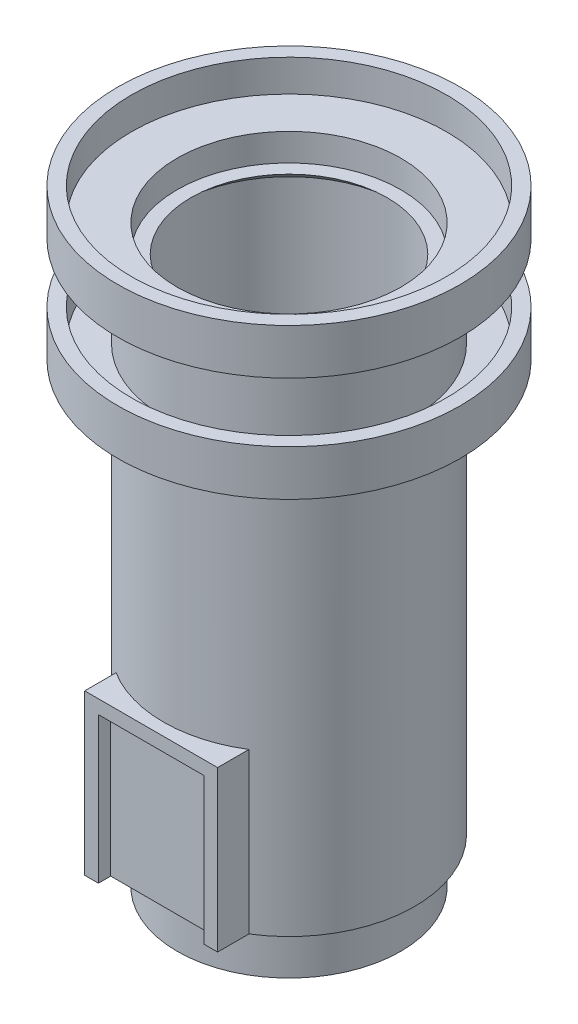
ISO-10303-21;
HEADER;
FILE_DESCRIPTION(('STEP AP214'),'2;1');
FILE_NAME('part.step','',(''),(''),'','','');
FILE_SCHEMA(('AUTOMOTIVE_DESIGN { 1 0 10303 214 1 1 1 1 }'));
ENDSEC;
DATA;
#1=APPLICATION_CONTEXT('core data for automotive mechanical design processes');
#2=APPLICATION_PROTOCOL_DEFINITION('international standard','automotive_design',2000,#1);
#3=PRODUCT_CONTEXT('',#1,'mechanical');
#4=PRODUCT('Part','Part','',(#3));
#5=PRODUCT_RELATED_PRODUCT_CATEGORY('part','',(#4));
#6=PRODUCT_DEFINITION_FORMATION('','',#4);
#7=PRODUCT_DEFINITION_CONTEXT('part definition',#1,'design');
#8=PRODUCT_DEFINITION('design','',#6,#7);
#9=PRODUCT_DEFINITION_SHAPE('','',#8);
#10=(LENGTH_UNIT() NAMED_UNIT(*) SI_UNIT(.MILLI.,.METRE.));
#11=(NAMED_UNIT(*) PLANE_ANGLE_UNIT() SI_UNIT($,.RADIAN.));
#12=(NAMED_UNIT(*) SI_UNIT($,.STERADIAN.) SOLID_ANGLE_UNIT());
#13=UNCERTAINTY_MEASURE_WITH_UNIT(LENGTH_MEASURE(1.E-05),#10,'distance_accuracy_value','');
#14=(GEOMETRIC_REPRESENTATION_CONTEXT(3) GLOBAL_UNCERTAINTY_ASSIGNED_CONTEXT((#13)) GLOBAL_UNIT_ASSIGNED_CONTEXT((#10,
#11,#12)) REPRESENTATION_CONTEXT('',''));
#15=CARTESIAN_POINT('',(0.,0.,0.));
#16=DIRECTION('',(0.,0.,1.));
#17=DIRECTION('',(1.,0.,0.));
#18=AXIS2_PLACEMENT_3D('',#15,#16,#17);
#19=CARTESIAN_POINT('',(-39.2129955139234,3.51989743721269,0.));
#20=DIRECTION('',(0.,-1.,0.));
#21=DIRECTION('',(1.,0.,0.));
#22=AXIS2_PLACEMENT_3D('',#19,#20,#21);
#23=PLANE('',#22);
#24=CARTESIAN_POINT('',(-17.7129955139234,3.51989743721269,0.));
#25=DIRECTION('',(0.,1.,0.));
#26=DIRECTION('',(-1.,0.,0.));
#27=AXIS2_PLACEMENT_3D('',#24,#25,#26);
#28=CIRCLE('',#27,21.5);
#29=CARTESIAN_POINT('',(-39.2129955139234,3.51989743721269,0.));
#30=VERTEX_POINT('',#29);
#31=EDGE_CURVE('E157',#30,#30,#28,.T.);
#32=ORIENTED_EDGE('',*,*,#31,.T.);
#33=EDGE_LOOP('',(#32));
#34=FACE_BOUND('',#33,.T.);
#35=CARTESIAN_POINT('',(-17.7129955139234,3.51989743721269,0.));
#36=DIRECTION('',(0.,1.,0.));
#37=DIRECTION('',(-1.,0.,0.));
#38=AXIS2_PLACEMENT_3D('',#35,#36,#37);
#39=CIRCLE('',#38,24.5);
#40=CARTESIAN_POINT('',(-42.2129955139234,3.51989743721269,0.));
#41=VERTEX_POINT('',#40);
#42=EDGE_CURVE('E11',#41,#41,#39,.T.);
#43=ORIENTED_EDGE('',*,*,#42,.F.);
#44=EDGE_LOOP('',(#43));
#45=FACE_BOUND('',#44,.T.);
#46=ADVANCED_FACE('F32',(#34,#45),#23,.T.);
#47=CARTESIAN_POINT('',(-17.7129955139234,104.262295081967,0.));
#48=DIRECTION('',(0.,1.,0.));
#49=DIRECTION('',(-1.,0.,0.));
#50=AXIS2_PLACEMENT_3D('',#47,#48,#49);
#51=CYLINDRICAL_SURFACE('',#50,24.5);
#52=ORIENTED_EDGE('',*,*,#42,.T.);
#53=EDGE_LOOP('',(#52));
#54=FACE_BOUND('',#53,.T.);
#55=CARTESIAN_POINT('',(-17.7129955139234,13.5198974372127,0.));
#56=DIRECTION('',(0.,1.,0.));
#57=DIRECTION('',(-1.,0.,0.));
#58=AXIS2_PLACEMENT_3D('',#55,#56,#57);
#59=CIRCLE('',#58,24.5);
#60=CARTESIAN_POINT('',(-42.2129955139234,13.5198974372127,0.));
#61=VERTEX_POINT('',#60);
#62=EDGE_CURVE('E39',#61,#61,#59,.T.);
#63=ORIENTED_EDGE('',*,*,#62,.F.);
#64=EDGE_LOOP('',(#63));
#65=FACE_BOUND('',#64,.T.);
#66=ADVANCED_FACE('F222',(#54,#65),#51,.T.);
#67=CARTESIAN_POINT('',(-42.2129955139234,13.5198974372127,0.));
#68=DIRECTION('',(0.,-1.,0.));
#69=DIRECTION('',(1.,0.,0.));
#70=AXIS2_PLACEMENT_3D('',#67,#68,#69);
#71=PLANE('',#70);
#72=DIRECTION('',(0.,0.,1.));
#73=VECTOR('',#72,1.);
#74=CARTESIAN_POINT('',(-29.267838598035,13.5198974372127,27.502521141036));
#75=LINE('',#74,#73);
#76=CARTESIAN_POINT('',(-29.267838598035,13.5198974372127,27.502521141036));
#77=VERTEX_POINT('',#76);
#78=CARTESIAN_POINT('',(-29.267838598035,13.5198974372127,30.202521141036));
#79=VERTEX_POINT('',#78);
#80=EDGE_CURVE('E97',#77,#79,#75,.T.);
#81=ORIENTED_EDGE('',*,*,#80,.T.);
#82=DIRECTION('',(-1.,0.,0.));
#83=VECTOR('',#82,1.);
#84=CARTESIAN_POINT('',(-32.267838598035,13.5198974372127,30.202521141036));
#85=LINE('',#84,#83);
#86=CARTESIAN_POINT('',(-32.267838598035,13.5198974372127,30.202521141036));
#87=VERTEX_POINT('',#86);
#88=EDGE_CURVE('E151',#79,#87,#85,.T.);
#89=ORIENTED_EDGE('',*,*,#88,.T.);
#90=DIRECTION('',(0.,0.,-1.));
#91=VECTOR('',#90,1.);
#92=CARTESIAN_POINT('',(-32.267838598035,13.5198974372127,23.332521141036));
#93=LINE('',#92,#91);
#94=CARTESIAN_POINT('',(-32.267838598035,13.5198974372127,23.332521141036));
#95=VERTEX_POINT('',#94);
#96=EDGE_CURVE('E139',#87,#95,#93,.T.);
#97=ORIENTED_EDGE('',*,*,#96,.T.);
#98=CARTESIAN_POINT('',(-17.7129955139234,13.5198974372127,0.));
#99=DIRECTION('',(0.,1.,0.));
#100=DIRECTION('',(-1.,0.,0.));
#101=AXIS2_PLACEMENT_3D('',#98,#99,#100);
#102=CIRCLE('',#101,27.5000000000001);
#103=CARTESIAN_POINT('',(-3.15815242981178,13.5198974372127,23.332521141036));
#104=VERTEX_POINT('',#103);
#105=EDGE_CURVE('E218',#104,#95,#102,.T.);
#106=ORIENTED_EDGE('',*,*,#105,.F.);
#107=DIRECTION('',(0.,0.,1.));
#108=VECTOR('',#107,1.);
#109=CARTESIAN_POINT('',(-3.15815242981178,13.5198974372127,23.332521141036));
#110=LINE('',#109,#108);
#111=CARTESIAN_POINT('',(-3.15815242981178,13.5198974372127,30.202521141036));
#112=VERTEX_POINT('',#111);
#113=EDGE_CURVE('E132',#104,#112,#110,.T.);
#114=ORIENTED_EDGE('',*,*,#113,.T.);
#115=CARTESIAN_POINT('',(-6.15815242981178,13.5198974372127,30.202521141036));
#116=VERTEX_POINT('',#115);
#117=EDGE_CURVE('E152',#112,#116,#85,.T.);
#118=ORIENTED_EDGE('',*,*,#117,.T.);
#119=DIRECTION('',(0.,0.,1.));
#120=VECTOR('',#119,1.);
#121=CARTESIAN_POINT('',(-6.15815242981178,13.5198974372127,27.502521141036));
#122=LINE('',#121,#120);
#123=CARTESIAN_POINT('',(-6.15815242981178,13.5198974372127,27.502521141036));
#124=VERTEX_POINT('',#123);
#125=EDGE_CURVE('E46',#124,#116,#122,.T.);
#126=ORIENTED_EDGE('',*,*,#125,.F.);
#127=DIRECTION('',(1.,0.,0.));
#128=VECTOR('',#127,1.);
#129=CARTESIAN_POINT('',(-29.267838598035,13.5198974372127,27.502521141036));
#130=LINE('',#129,#128);
#131=EDGE_CURVE('E113',#77,#124,#130,.T.);
#132=ORIENTED_EDGE('',*,*,#131,.F.);
#133=EDGE_LOOP('',(#81,#89,#97,#106,#114,#118,#126,#132));
#134=FACE_BOUND('',#133,.T.);
#135=ORIENTED_EDGE('',*,*,#62,.T.);
#136=EDGE_LOOP('',(#135));
#137=FACE_BOUND('',#136,.T.);
#138=ADVANCED_FACE('F117',(#134,#137),#71,.T.);
#139=CARTESIAN_POINT('',(-17.7129955139234,104.262295081967,0.));
#140=DIRECTION('',(0.,1.,0.));
#141=DIRECTION('',(-1.,0.,0.));
#142=AXIS2_PLACEMENT_3D('',#139,#140,#141);
#143=CYLINDRICAL_SURFACE('',#142,27.5000000000001);
#144=DIRECTION('',(0.,-1.,0.));
#145=VECTOR('',#144,1.);
#146=CARTESIAN_POINT('',(-32.267838598035,48.5198974372127,23.332521141036));
#147=LINE('',#146,#145);
#148=CARTESIAN_POINT('',(-32.267838598035,48.5198974372127,23.332521141036));
#149=VERTEX_POINT('',#148);
#150=EDGE_CURVE('E54',#149,#95,#147,.T.);
#151=ORIENTED_EDGE('',*,*,#150,.F.);
#152=CARTESIAN_POINT('',(-17.7129955139234,48.5198974372127,0.));
#153=DIRECTION('',(0.,1.,0.));
#154=DIRECTION('',(-1.,0.,0.));
#155=AXIS2_PLACEMENT_3D('',#152,#153,#154);
#156=CIRCLE('',#155,27.5);
#157=CARTESIAN_POINT('',(-3.15815242981179,48.5198974372127,23.332521141036));
#158=VERTEX_POINT('',#157);
#159=EDGE_CURVE('E136',#149,#158,#156,.T.);
#160=ORIENTED_EDGE('',*,*,#159,.T.);
#161=DIRECTION('',(0.,-1.,0.));
#162=VECTOR('',#161,1.);
#163=CARTESIAN_POINT('',(-3.15815242981179,48.5198974372127,23.332521141036));
#164=LINE('',#163,#162);
#165=EDGE_CURVE('E148',#158,#104,#164,.T.);
#166=ORIENTED_EDGE('',*,*,#165,.T.);
#167=ORIENTED_EDGE('',*,*,#105,.T.);
#168=EDGE_LOOP('',(#151,#160,#166,#167));
#169=FACE_BOUND('',#168,.T.);
#170=CARTESIAN_POINT('',(-17.7129955139234,100.519897437213,0.));
#171=DIRECTION('',(0.,1.,0.));
#172=DIRECTION('',(-1.,0.,0.));
#173=AXIS2_PLACEMENT_3D('',#170,#171,#172);
#174=CIRCLE('',#173,27.5000000000001);
#175=CARTESIAN_POINT('',(-45.2129955139235,100.519897437213,0.));
#176=VERTEX_POINT('',#175);
#177=EDGE_CURVE('E215',#176,#176,#174,.T.);
#178=ORIENTED_EDGE('',*,*,#177,.F.);
#179=EDGE_LOOP('',(#178));
#180=FACE_BOUND('',#179,.T.);
#181=ADVANCED_FACE('F229',(#169,#180),#143,.T.);
#182=CARTESIAN_POINT('',(-17.7129955139234,103.519897437213,0.));
#183=DIRECTION('',(0.,1.,0.));
#184=DIRECTION('',(-1.,0.,0.));
#185=AXIS2_PLACEMENT_3D('',#182,#183,#184);
#186=CONICAL_SURFACE('',#185,37.5000000000001,1.27933953231703);
#187=ORIENTED_EDGE('',*,*,#177,.T.);
#188=EDGE_LOOP('',(#187));
#189=FACE_BOUND('',#188,.T.);
#190=CARTESIAN_POINT('',(-17.7129955139234,103.519897437213,0.));
#191=DIRECTION('',(0.,1.,0.));
#192=DIRECTION('',(-1.,0.,0.));
#193=AXIS2_PLACEMENT_3D('',#190,#191,#192);
#194=CIRCLE('',#193,37.5000000000001);
#195=CARTESIAN_POINT('',(-55.2129955139235,103.519897437213,0.));
#196=VERTEX_POINT('',#195);
#197=EDGE_CURVE('E212',#196,#196,#194,.T.);
#198=ORIENTED_EDGE('',*,*,#197,.F.);
#199=EDGE_LOOP('',(#198));
#200=FACE_BOUND('',#199,.T.);
#201=ADVANCED_FACE('F235',(#189,#200),#186,.T.);
#202=CARTESIAN_POINT('',(-17.7129955139234,104.262295081967,0.));
#203=DIRECTION('',(0.,1.,0.));
#204=DIRECTION('',(-1.,0.,0.));
#205=AXIS2_PLACEMENT_3D('',#202,#203,#204);
#206=CYLINDRICAL_SURFACE('',#205,37.5000000000001);
#207=ORIENTED_EDGE('',*,*,#197,.T.);
#208=EDGE_LOOP('',(#207));
#209=FACE_BOUND('',#208,.T.);
#210=CARTESIAN_POINT('',(-17.7129955139234,113.519897437213,0.));
#211=DIRECTION('',(0.,1.,0.));
#212=DIRECTION('',(-1.,0.,0.));
#213=AXIS2_PLACEMENT_3D('',#210,#211,#212);
#214=CIRCLE('',#213,37.5000000000001);
#215=CARTESIAN_POINT('',(-55.2129955139235,113.519897437213,0.));
#216=VERTEX_POINT('',#215);
#217=EDGE_CURVE('E209',#216,#216,#214,.T.);
#218=ORIENTED_EDGE('',*,*,#217,.F.);
#219=EDGE_LOOP('',(#218));
#220=FACE_BOUND('',#219,.T.);
#221=ADVANCED_FACE('F238',(#209,#220),#206,.T.);
#222=CARTESIAN_POINT('',(-55.2129955139235,113.519897437213,0.));
#223=DIRECTION('',(0.,1.,0.));
#224=DIRECTION('',(-1.,0.,0.));
#225=AXIS2_PLACEMENT_3D('',#222,#223,#224);
#226=PLANE('',#225);
#227=ORIENTED_EDGE('',*,*,#217,.T.);
#228=EDGE_LOOP('',(#227));
#229=FACE_BOUND('',#228,.T.);
#230=CARTESIAN_POINT('',(-17.7129955139234,113.519897437213,0.));
#231=DIRECTION('',(0.,1.,0.));
#232=DIRECTION('',(-1.,0.,0.));
#233=AXIS2_PLACEMENT_3D('',#230,#231,#232);
#234=CIRCLE('',#233,34.5000000000001);
#235=CARTESIAN_POINT('',(-52.2129955139235,113.519897437213,0.));
#236=VERTEX_POINT('',#235);
#237=EDGE_CURVE('E206',#236,#236,#234,.T.);
#238=ORIENTED_EDGE('',*,*,#237,.F.);
#239=EDGE_LOOP('',(#238));
#240=FACE_BOUND('',#239,.T.);
#241=ADVANCED_FACE('F242',(#229,#240),#226,.T.);
#242=CARTESIAN_POINT('',(-17.7129955139234,104.262295081967,0.));
#243=DIRECTION('',(0.,1.,0.));
#244=DIRECTION('',(-1.,0.,0.));
#245=AXIS2_PLACEMENT_3D('',#242,#243,#244);
#246=CYLINDRICAL_SURFACE('',#245,34.5000000000001);
#247=ORIENTED_EDGE('',*,*,#237,.T.);
#248=EDGE_LOOP('',(#247));
#249=FACE_BOUND('',#248,.T.);
#250=CARTESIAN_POINT('',(-17.7129955139234,106.519897437213,0.));
#251=DIRECTION('',(0.,1.,0.));
#252=DIRECTION('',(-1.,0.,0.));
#253=AXIS2_PLACEMENT_3D('',#250,#251,#252);
#254=CIRCLE('',#253,34.5000000000001);
#255=CARTESIAN_POINT('',(-52.2129955139235,106.519897437213,0.));
#256=VERTEX_POINT('',#255);
#257=EDGE_CURVE('E203',#256,#256,#254,.T.);
#258=ORIENTED_EDGE('',*,*,#257,.F.);
#259=EDGE_LOOP('',(#258));
#260=FACE_BOUND('',#259,.T.);
#261=ADVANCED_FACE('F246',(#249,#260),#246,.F.);
#262=CARTESIAN_POINT('',(-52.2129955139235,106.519897437213,0.));
#263=DIRECTION('',(0.,1.,0.));
#264=DIRECTION('',(-1.,0.,0.));
#265=AXIS2_PLACEMENT_3D('',#262,#263,#264);
#266=PLANE('',#265);
#267=ORIENTED_EDGE('',*,*,#257,.T.);
#268=EDGE_LOOP('',(#267));
#269=FACE_BOUND('',#268,.T.);
#270=CARTESIAN_POINT('',(-17.7129955139234,106.519897437213,0.));
#271=DIRECTION('',(0.,1.,0.));
#272=DIRECTION('',(-1.,0.,0.));
#273=AXIS2_PLACEMENT_3D('',#270,#271,#272);
#274=CIRCLE('',#273,27.5000000000001);
#275=CARTESIAN_POINT('',(-45.2129955139235,106.519897437213,0.));
#276=VERTEX_POINT('',#275);
#277=EDGE_CURVE('E200',#276,#276,#274,.T.);
#278=ORIENTED_EDGE('',*,*,#277,.F.);
#279=EDGE_LOOP('',(#278));
#280=FACE_BOUND('',#279,.T.);
#281=ADVANCED_FACE('F250',(#269,#280),#266,.T.);
#282=CARTESIAN_POINT('',(-17.7129955139234,104.262295081967,0.));
#283=DIRECTION('',(0.,1.,0.));
#284=DIRECTION('',(-1.,0.,0.));
#285=AXIS2_PLACEMENT_3D('',#282,#283,#284);
#286=CYLINDRICAL_SURFACE('',#285,27.5000000000001);
#287=ORIENTED_EDGE('',*,*,#277,.T.);
#288=EDGE_LOOP('',(#287));
#289=FACE_BOUND('',#288,.T.);
#290=CARTESIAN_POINT('',(-17.7129955139234,123.519897437213,0.));
#291=DIRECTION('',(0.,1.,0.));
#292=DIRECTION('',(-1.,0.,0.));
#293=AXIS2_PLACEMENT_3D('',#290,#291,#292);
#294=CIRCLE('',#293,27.5000000000001);
#295=CARTESIAN_POINT('',(-45.2129955139235,123.519897437213,0.));
#296=VERTEX_POINT('',#295);
#297=EDGE_CURVE('E197',#296,#296,#294,.T.);
#298=ORIENTED_EDGE('',*,*,#297,.F.);
#299=EDGE_LOOP('',(#298));
#300=FACE_BOUND('',#299,.T.);
#301=ADVANCED_FACE('F254',(#289,#300),#286,.T.);
#302=CARTESIAN_POINT('',(-17.7129955139234,126.519897437213,0.));
#303=DIRECTION('',(0.,1.,0.));
#304=DIRECTION('',(-1.,0.,0.));
#305=AXIS2_PLACEMENT_3D('',#302,#303,#304);
#306=CONICAL_SURFACE('',#305,37.5000000000001,1.27933953231703);
#307=ORIENTED_EDGE('',*,*,#297,.T.);
#308=EDGE_LOOP('',(#307));
#309=FACE_BOUND('',#308,.T.);
#310=CARTESIAN_POINT('',(-17.7129955139234,126.519897437213,0.));
#311=DIRECTION('',(0.,1.,0.));
#312=DIRECTION('',(-1.,0.,0.));
#313=AXIS2_PLACEMENT_3D('',#310,#311,#312);
#314=CIRCLE('',#313,37.5000000000001);
#315=CARTESIAN_POINT('',(-55.2129955139235,126.519897437213,0.));
#316=VERTEX_POINT('',#315);
#317=EDGE_CURVE('E194',#316,#316,#314,.T.);
#318=ORIENTED_EDGE('',*,*,#317,.F.);
#319=EDGE_LOOP('',(#318));
#320=FACE_BOUND('',#319,.T.);
#321=ADVANCED_FACE('F258',(#309,#320),#306,.T.);
#322=CARTESIAN_POINT('',(-17.7129955139234,104.262295081967,0.));
#323=DIRECTION('',(0.,1.,0.));
#324=DIRECTION('',(-1.,0.,0.));
#325=AXIS2_PLACEMENT_3D('',#322,#323,#324);
#326=CYLINDRICAL_SURFACE('',#325,37.5000000000001);
#327=ORIENTED_EDGE('',*,*,#317,.T.);
#328=EDGE_LOOP('',(#327));
#329=FACE_BOUND('',#328,.T.);
#330=CARTESIAN_POINT('',(-17.7129955139234,136.519897437213,0.));
#331=DIRECTION('',(0.,1.,0.));
#332=DIRECTION('',(-1.,0.,0.));
#333=AXIS2_PLACEMENT_3D('',#330,#331,#332);
#334=CIRCLE('',#333,37.5000000000001);
#335=CARTESIAN_POINT('',(-55.2129955139235,136.519897437213,0.));
#336=VERTEX_POINT('',#335);
#337=EDGE_CURVE('E191',#336,#336,#334,.T.);
#338=ORIENTED_EDGE('',*,*,#337,.F.);
#339=EDGE_LOOP('',(#338));
#340=FACE_BOUND('',#339,.T.);
#341=ADVANCED_FACE('F262',(#329,#340),#326,.T.);
#342=CARTESIAN_POINT('',(-55.2129955139235,136.519897437213,0.));
#343=DIRECTION('',(0.,1.,0.));
#344=DIRECTION('',(-1.,0.,0.));
#345=AXIS2_PLACEMENT_3D('',#342,#343,#344);
#346=PLANE('',#345);
#347=ORIENTED_EDGE('',*,*,#337,.T.);
#348=EDGE_LOOP('',(#347));
#349=FACE_BOUND('',#348,.T.);
#350=CARTESIAN_POINT('',(-17.7129955139234,136.519897437213,0.));
#351=DIRECTION('',(0.,1.,0.));
#352=DIRECTION('',(-1.,0.,0.));
#353=AXIS2_PLACEMENT_3D('',#350,#351,#352);
#354=CIRCLE('',#353,34.5000000000001);
#355=CARTESIAN_POINT('',(-52.2129955139235,136.519897437213,0.));
#356=VERTEX_POINT('',#355);
#357=EDGE_CURVE('E188',#356,#356,#354,.T.);
#358=ORIENTED_EDGE('',*,*,#357,.F.);
#359=EDGE_LOOP('',(#358));
#360=FACE_BOUND('',#359,.T.);
#361=ADVANCED_FACE('F266',(#349,#360),#346,.T.);
#362=CARTESIAN_POINT('',(-17.7129955139234,104.262295081967,0.));
#363=DIRECTION('',(0.,1.,0.));
#364=DIRECTION('',(-1.,0.,0.));
#365=AXIS2_PLACEMENT_3D('',#362,#363,#364);
#366=CYLINDRICAL_SURFACE('',#365,34.5000000000001);
#367=ORIENTED_EDGE('',*,*,#357,.T.);
#368=EDGE_LOOP('',(#367));
#369=FACE_BOUND('',#368,.T.);
#370=CARTESIAN_POINT('',(-17.7129955139234,129.519897437213,0.));
#371=DIRECTION('',(0.,1.,0.));
#372=DIRECTION('',(-1.,0.,0.));
#373=AXIS2_PLACEMENT_3D('',#370,#371,#372);
#374=CIRCLE('',#373,34.5000000000001);
#375=CARTESIAN_POINT('',(-52.2129955139235,129.519897437213,0.));
#376=VERTEX_POINT('',#375);
#377=EDGE_CURVE('E185',#376,#376,#374,.T.);
#378=ORIENTED_EDGE('',*,*,#377,.F.);
#379=EDGE_LOOP('',(#378));
#380=FACE_BOUND('',#379,.T.);
#381=ADVANCED_FACE('F270',(#369,#380),#366,.F.);
#382=CARTESIAN_POINT('',(-52.2129955139235,129.519897437213,0.));
#383=DIRECTION('',(0.,1.,0.));
#384=DIRECTION('',(-1.,0.,0.));
#385=AXIS2_PLACEMENT_3D('',#382,#383,#384);
#386=PLANE('',#385);
#387=ORIENTED_EDGE('',*,*,#377,.T.);
#388=EDGE_LOOP('',(#387));
#389=FACE_BOUND('',#388,.T.);
#390=CARTESIAN_POINT('',(-17.7129955139234,129.519897437213,0.));
#391=DIRECTION('',(0.,1.,0.));
#392=DIRECTION('',(-1.,0.,0.));
#393=AXIS2_PLACEMENT_3D('',#390,#391,#392);
#394=CIRCLE('',#393,24.5);
#395=CARTESIAN_POINT('',(-42.2129955139234,129.519897437213,0.));
#396=VERTEX_POINT('',#395);
#397=EDGE_CURVE('E182',#396,#396,#394,.T.);
#398=ORIENTED_EDGE('',*,*,#397,.F.);
#399=EDGE_LOOP('',(#398));
#400=FACE_BOUND('',#399,.T.);
#401=ADVANCED_FACE('F274',(#389,#400),#386,.T.);
#402=CARTESIAN_POINT('',(-17.7129955139234,104.262295081967,0.));
#403=DIRECTION('',(0.,1.,0.));
#404=DIRECTION('',(-1.,0.,0.));
#405=AXIS2_PLACEMENT_3D('',#402,#403,#404);
#406=CYLINDRICAL_SURFACE('',#405,24.5);
#407=ORIENTED_EDGE('',*,*,#397,.T.);
#408=EDGE_LOOP('',(#407));
#409=FACE_BOUND('',#408,.T.);
#410=CARTESIAN_POINT('',(-17.7129955139234,123.519897437213,0.));
#411=DIRECTION('',(0.,1.,0.));
#412=DIRECTION('',(-1.,0.,0.));
#413=AXIS2_PLACEMENT_3D('',#410,#411,#412);
#414=CIRCLE('',#413,24.5);
#415=CARTESIAN_POINT('',(-42.2129955139234,123.519897437213,0.));
#416=VERTEX_POINT('',#415);
#417=EDGE_CURVE('E179',#416,#416,#414,.T.);
#418=ORIENTED_EDGE('',*,*,#417,.F.);
#419=EDGE_LOOP('',(#418));
#420=FACE_BOUND('',#419,.T.);
#421=ADVANCED_FACE('F278',(#409,#420),#406,.F.);
#422=CARTESIAN_POINT('',(-42.2129955139234,123.519897437213,0.));
#423=DIRECTION('',(0.,1.,0.));
#424=DIRECTION('',(-1.,0.,0.));
#425=AXIS2_PLACEMENT_3D('',#422,#423,#424);
#426=PLANE('',#425);
#427=ORIENTED_EDGE('',*,*,#417,.T.);
#428=EDGE_LOOP('',(#427));
#429=FACE_BOUND('',#428,.T.);
#430=CARTESIAN_POINT('',(-17.7129955139234,123.519897437213,0.));
#431=DIRECTION('',(0.,1.,0.));
#432=DIRECTION('',(-1.,0.,0.));
#433=AXIS2_PLACEMENT_3D('',#430,#431,#432);
#434=CIRCLE('',#433,21.5);
#435=CARTESIAN_POINT('',(-39.2129955139234,123.519897437213,0.));
#436=VERTEX_POINT('',#435);
#437=EDGE_CURVE('E176',#436,#436,#434,.T.);
#438=ORIENTED_EDGE('',*,*,#437,.F.);
#439=EDGE_LOOP('',(#438));
#440=FACE_BOUND('',#439,.T.);
#441=ADVANCED_FACE('F282',(#429,#440),#426,.T.);
#442=CARTESIAN_POINT('',(-17.7129955139234,120.917625561823,0.));
#443=DIRECTION('',(0.,-1.,0.));
#444=DIRECTION('',(1.,0.,0.));
#445=AXIS2_PLACEMENT_3D('',#442,#443,#444);
#446=CONICAL_SURFACE('',#445,24.5,0.856273326647691);
#447=ORIENTED_EDGE('',*,*,#437,.T.);
#448=EDGE_LOOP('',(#447));
#449=FACE_BOUND('',#448,.T.);
#450=CARTESIAN_POINT('',(-17.7129955139234,120.917625561823,0.));
#451=DIRECTION('',(0.,1.,0.));
#452=DIRECTION('',(-1.,0.,0.));
#453=AXIS2_PLACEMENT_3D('',#450,#451,#452);
#454=CIRCLE('',#453,24.5);
#455=CARTESIAN_POINT('',(-42.2129955139234,120.917625561823,0.));
#456=VERTEX_POINT('',#455);
#457=EDGE_CURVE('E173',#456,#456,#454,.T.);
#458=ORIENTED_EDGE('',*,*,#457,.F.);
#459=EDGE_LOOP('',(#458));
#460=FACE_BOUND('',#459,.T.);
#461=ADVANCED_FACE('F286',(#449,#460),#446,.F.);
#462=CARTESIAN_POINT('',(-17.7129955139234,104.262295081967,0.));
#463=DIRECTION('',(0.,1.,0.));
#464=DIRECTION('',(-1.,0.,0.));
#465=AXIS2_PLACEMENT_3D('',#462,#463,#464);
#466=CYLINDRICAL_SURFACE('',#465,24.5);
#467=ORIENTED_EDGE('',*,*,#457,.T.);
#468=EDGE_LOOP('',(#467));
#469=FACE_BOUND('',#468,.T.);
#470=CARTESIAN_POINT('',(-17.7129955139234,16.5198974372127,0.));
#471=DIRECTION('',(0.,1.,0.));
#472=DIRECTION('',(-1.,0.,0.));
#473=AXIS2_PLACEMENT_3D('',#470,#471,#472);
#474=CIRCLE('',#473,24.5);
#475=CARTESIAN_POINT('',(-42.2129955139234,16.5198974372127,0.));
#476=VERTEX_POINT('',#475);
#477=EDGE_CURVE('E170',#476,#476,#474,.T.);
#478=ORIENTED_EDGE('',*,*,#477,.F.);
#479=EDGE_LOOP('',(#478));
#480=FACE_BOUND('',#479,.T.);
#481=ADVANCED_FACE('F290',(#469,#480),#466,.F.);
#482=CARTESIAN_POINT('',(-39.2129955139234,16.5198974372127,0.));
#483=DIRECTION('',(0.,1.,0.));
#484=DIRECTION('',(-1.,0.,0.));
#485=AXIS2_PLACEMENT_3D('',#482,#483,#484);
#486=PLANE('',#485);
#487=ORIENTED_EDGE('',*,*,#477,.T.);
#488=EDGE_LOOP('',(#487));
#489=FACE_BOUND('',#488,.T.);
#490=CARTESIAN_POINT('',(-17.7129955139234,16.5198974372127,0.));
#491=DIRECTION('',(0.,1.,0.));
#492=DIRECTION('',(-1.,0.,0.));
#493=AXIS2_PLACEMENT_3D('',#490,#491,#492);
#494=CIRCLE('',#493,21.5);
#495=CARTESIAN_POINT('',(-39.2129955139234,16.5198974372127,0.));
#496=VERTEX_POINT('',#495);
#497=EDGE_CURVE('E167',#496,#496,#494,.T.);
#498=ORIENTED_EDGE('',*,*,#497,.F.);
#499=EDGE_LOOP('',(#498));
#500=FACE_BOUND('',#499,.T.);
#501=ADVANCED_FACE('F294',(#489,#500),#486,.T.);
#502=CARTESIAN_POINT('',(-17.7129955139234,104.262295081967,0.));
#503=DIRECTION('',(0.,1.,0.));
#504=DIRECTION('',(-1.,0.,0.));
#505=AXIS2_PLACEMENT_3D('',#502,#503,#504);
#506=CYLINDRICAL_SURFACE('',#505,21.5);
#507=ORIENTED_EDGE('',*,*,#497,.T.);
#508=EDGE_LOOP('',(#507));
#509=FACE_BOUND('',#508,.T.);
#510=ORIENTED_EDGE('',*,*,#31,.F.);
#511=EDGE_LOOP('',(#510));
#512=FACE_BOUND('',#511,.T.);
#513=ADVANCED_FACE('F298',(#509,#512),#506,.F.);
#514=CARTESIAN_POINT('',(-32.267838598035,48.5198974372127,23.332521141036));
#515=DIRECTION('',(-1.,0.,0.));
#516=DIRECTION('',(0.,-1.,0.));
#517=AXIS2_PLACEMENT_3D('',#514,#515,#516);
#518=PLANE('',#517);
#519=ORIENTED_EDGE('',*,*,#96,.F.);
#520=DIRECTION('',(0.,-1.,0.));
#521=VECTOR('',#520,1.);
#522=CARTESIAN_POINT('',(-32.267838598035,48.5198974372127,30.202521141036));
#523=LINE('',#522,#521);
#524=CARTESIAN_POINT('',(-32.267838598035,48.5198974372127,30.202521141036));
#525=VERTEX_POINT('',#524);
#526=EDGE_CURVE('E158',#525,#87,#523,.T.);
#527=ORIENTED_EDGE('',*,*,#526,.F.);
#528=DIRECTION('',(0.,0.,-1.));
#529=VECTOR('',#528,1.);
#530=CARTESIAN_POINT('',(-32.267838598035,48.5198974372127,23.332521141036));
#531=LINE('',#530,#529);
#532=EDGE_CURVE('E145',#525,#149,#531,.T.);
#533=ORIENTED_EDGE('',*,*,#532,.T.);
#534=ORIENTED_EDGE('',*,*,#150,.T.);
#535=EDGE_LOOP('',(#519,#527,#533,#534));
#536=FACE_BOUND('',#535,.T.);
#537=ADVANCED_FACE('F302',(#536),#518,.T.);
#538=CARTESIAN_POINT('',(-32.267838598035,48.5198974372127,30.202521141036));
#539=DIRECTION('',(0.,0.,1.));
#540=DIRECTION('',(1.,0.,0.));
#541=AXIS2_PLACEMENT_3D('',#538,#539,#540);
#542=PLANE('',#541);
#543=DIRECTION('',(0.,-1.,0.));
#544=VECTOR('',#543,1.);
#545=CARTESIAN_POINT('',(-29.267838598035,13.5198974372127,30.202521141036));
#546=LINE('',#545,#544);
#547=CARTESIAN_POINT('',(-29.267838598035,45.5198974372127,30.202521141036));
#548=VERTEX_POINT('',#547);
#549=EDGE_CURVE('E103',#548,#79,#546,.T.);
#550=ORIENTED_EDGE('',*,*,#549,.F.);
#551=DIRECTION('',(-1.,0.,0.));
#552=VECTOR('',#551,1.);
#553=CARTESIAN_POINT('',(-29.267838598035,45.5198974372127,30.202521141036));
#554=LINE('',#553,#552);
#555=CARTESIAN_POINT('',(-6.15815242981178,45.5198974372127,30.202521141036));
#556=VERTEX_POINT('',#555);
#557=EDGE_CURVE('E115',#556,#548,#554,.T.);
#558=ORIENTED_EDGE('',*,*,#557,.F.);
#559=DIRECTION('',(0.,1.,0.));
#560=VECTOR('',#559,1.);
#561=CARTESIAN_POINT('',(-6.15815242981178,13.5198974372127,30.202521141036));
#562=LINE('',#561,#560);
#563=EDGE_CURVE('E126',#116,#556,#562,.T.);
#564=ORIENTED_EDGE('',*,*,#563,.F.);
#565=ORIENTED_EDGE('',*,*,#117,.F.);
#566=DIRECTION('',(0.,-1.,0.));
#567=VECTOR('',#566,1.);
#568=CARTESIAN_POINT('',(-3.15815242981178,48.5198974372127,30.202521141036));
#569=LINE('',#568,#567);
#570=CARTESIAN_POINT('',(-3.15815242981178,48.5198974372127,30.202521141036));
#571=VERTEX_POINT('',#570);
#572=EDGE_CURVE('E161',#571,#112,#569,.T.);
#573=ORIENTED_EDGE('',*,*,#572,.F.);
#574=DIRECTION('',(-1.,0.,0.));
#575=VECTOR('',#574,1.);
#576=CARTESIAN_POINT('',(-32.267838598035,48.5198974372127,30.202521141036));
#577=LINE('',#576,#575);
#578=EDGE_CURVE('E142',#571,#525,#577,.T.);
#579=ORIENTED_EDGE('',*,*,#578,.T.);
#580=ORIENTED_EDGE('',*,*,#526,.T.);
#581=ORIENTED_EDGE('',*,*,#88,.F.);
#582=EDGE_LOOP('',(#550,#558,#564,#565,#573,#579,#580,#581));
#583=FACE_BOUND('',#582,.T.);
#584=ADVANCED_FACE('F308',(#583),#542,.T.);
#585=CARTESIAN_POINT('',(-3.15815242981179,48.5198974372127,23.332521141036));
#586=DIRECTION('',(1.,0.,0.));
#587=DIRECTION('',(0.,0.,-1.));
#588=AXIS2_PLACEMENT_3D('',#585,#586,#587);
#589=PLANE('',#588);
#590=ORIENTED_EDGE('',*,*,#113,.F.);
#591=ORIENTED_EDGE('',*,*,#165,.F.);
#592=DIRECTION('',(0.,0.,1.));
#593=VECTOR('',#592,1.);
#594=CARTESIAN_POINT('',(-3.15815242981179,48.5198974372127,23.332521141036));
#595=LINE('',#594,#593);
#596=EDGE_CURVE('E138',#158,#571,#595,.T.);
#597=ORIENTED_EDGE('',*,*,#596,.T.);
#598=ORIENTED_EDGE('',*,*,#572,.T.);
#599=EDGE_LOOP('',(#590,#591,#597,#598));
#600=FACE_BOUND('',#599,.T.);
#601=ADVANCED_FACE('F304',(#600),#589,.T.);
#602=CARTESIAN_POINT('',(-17.7129955139234,48.5198974372127,0.));
#603=DIRECTION('',(0.,1.,0.));
#604=DIRECTION('',(-1.,0.,0.));
#605=AXIS2_PLACEMENT_3D('',#602,#603,#604);
#606=PLANE('',#605);
#607=ORIENTED_EDGE('',*,*,#159,.F.);
#608=ORIENTED_EDGE('',*,*,#532,.F.);
#609=ORIENTED_EDGE('',*,*,#578,.F.);
#610=ORIENTED_EDGE('',*,*,#596,.F.);
#611=EDGE_LOOP('',(#607,#608,#609,#610));
#612=FACE_BOUND('',#611,.T.);
#613=ADVANCED_FACE('F307',(#612),#606,.T.);
#614=CARTESIAN_POINT('',(-29.267838598035,13.5198974372127,27.502521141036));
#615=DIRECTION('',(-1.,0.,0.));
#616=DIRECTION('',(0.,0.,1.));
#617=AXIS2_PLACEMENT_3D('',#614,#615,#616);
#618=PLANE('',#617);
#619=ORIENTED_EDGE('',*,*,#549,.T.);
#620=ORIENTED_EDGE('',*,*,#80,.F.);
#621=DIRECTION('',(0.,-1.,0.));
#622=VECTOR('',#621,1.);
#623=CARTESIAN_POINT('',(-29.267838598035,13.5198974372127,27.502521141036));
#624=LINE('',#623,#622);
#625=CARTESIAN_POINT('',(-29.267838598035,45.5198974372127,27.502521141036));
#626=VERTEX_POINT('',#625);
#627=EDGE_CURVE('E100',#626,#77,#624,.T.);
#628=ORIENTED_EDGE('',*,*,#627,.F.);
#629=DIRECTION('',(0.,0.,1.));
#630=VECTOR('',#629,1.);
#631=CARTESIAN_POINT('',(-29.267838598035,45.5198974372127,27.502521141036));
#632=LINE('',#631,#630);
#633=EDGE_CURVE('E130',#626,#548,#632,.T.);
#634=ORIENTED_EDGE('',*,*,#633,.T.);
#635=EDGE_LOOP('',(#619,#620,#628,#634));
#636=FACE_BOUND('',#635,.T.);
#637=ADVANCED_FACE('F99',(#636),#618,.F.);
#638=CARTESIAN_POINT('',(-29.267838598035,45.5198974372127,27.502521141036));
#639=DIRECTION('',(0.,1.,0.));
#640=DIRECTION('',(0.,0.,1.));
#641=AXIS2_PLACEMENT_3D('',#638,#639,#640);
#642=PLANE('',#641);
#643=ORIENTED_EDGE('',*,*,#557,.T.);
#644=ORIENTED_EDGE('',*,*,#633,.F.);
#645=DIRECTION('',(-1.,0.,0.));
#646=VECTOR('',#645,1.);
#647=CARTESIAN_POINT('',(-29.267838598035,45.5198974372127,27.502521141036));
#648=LINE('',#647,#646);
#649=CARTESIAN_POINT('',(-6.15815242981178,45.5198974372127,27.502521141036));
#650=VERTEX_POINT('',#649);
#651=EDGE_CURVE('E107',#650,#626,#648,.T.);
#652=ORIENTED_EDGE('',*,*,#651,.F.);
#653=DIRECTION('',(0.,0.,1.));
#654=VECTOR('',#653,1.);
#655=CARTESIAN_POINT('',(-6.15815242981178,45.5198974372127,27.502521141036));
#656=LINE('',#655,#654);
#657=EDGE_CURVE('E133',#650,#556,#656,.T.);
#658=ORIENTED_EDGE('',*,*,#657,.T.);
#659=EDGE_LOOP('',(#643,#644,#652,#658));
#660=FACE_BOUND('',#659,.T.);
#661=ADVANCED_FACE('F321',(#660),#642,.F.);
#662=CARTESIAN_POINT('',(-6.15815242981178,13.5198974372127,27.502521141036));
#663=DIRECTION('',(1.,0.,0.));
#664=DIRECTION('',(0.,0.,-1.));
#665=AXIS2_PLACEMENT_3D('',#662,#663,#664);
#666=PLANE('',#665);
#667=ORIENTED_EDGE('',*,*,#563,.T.);
#668=ORIENTED_EDGE('',*,*,#657,.F.);
#669=DIRECTION('',(0.,1.,0.));
#670=VECTOR('',#669,1.);
#671=CARTESIAN_POINT('',(-6.15815242981178,13.5198974372127,27.502521141036));
#672=LINE('',#671,#670);
#673=EDGE_CURVE('E120',#124,#650,#672,.T.);
#674=ORIENTED_EDGE('',*,*,#673,.F.);
#675=ORIENTED_EDGE('',*,*,#125,.T.);
#676=EDGE_LOOP('',(#667,#668,#674,#675));
#677=FACE_BOUND('',#676,.T.);
#678=ADVANCED_FACE('F322',(#677),#666,.F.);
#679=CARTESIAN_POINT('',(0.,0.,27.502521141036));
#680=DIRECTION('',(0.,0.,-1.));
#681=DIRECTION('',(-1.,0.,0.));
#682=AXIS2_PLACEMENT_3D('',#679,#680,#681);
#683=PLANE('',#682);
#684=ORIENTED_EDGE('',*,*,#627,.T.);
#685=ORIENTED_EDGE('',*,*,#131,.T.);
#686=ORIENTED_EDGE('',*,*,#673,.T.);
#687=ORIENTED_EDGE('',*,*,#651,.T.);
#688=EDGE_LOOP('',(#684,#685,#686,#687));
#689=FACE_BOUND('',#688,.T.);
#690=ADVANCED_FACE('F111',(#689),#683,.F.);
#691=CLOSED_SHELL('',(#46,#66,#138,#181,#201,#221,#241,#261,#281,#301,#321,#341,#361,#381,#401,
#421,#441,#461,#481,#501,#513,#537,#584,#601,#613,#637,#661,#678,#690));
#692=MANIFOLD_SOLID_BREP('B2',#691);
#693=ADVANCED_BREP_SHAPE_REPRESENTATION('',(#18,#692),#14);
#694=SHAPE_DEFINITION_REPRESENTATION(#9,#693);
ENDSEC;
END-ISO-10303-21;
